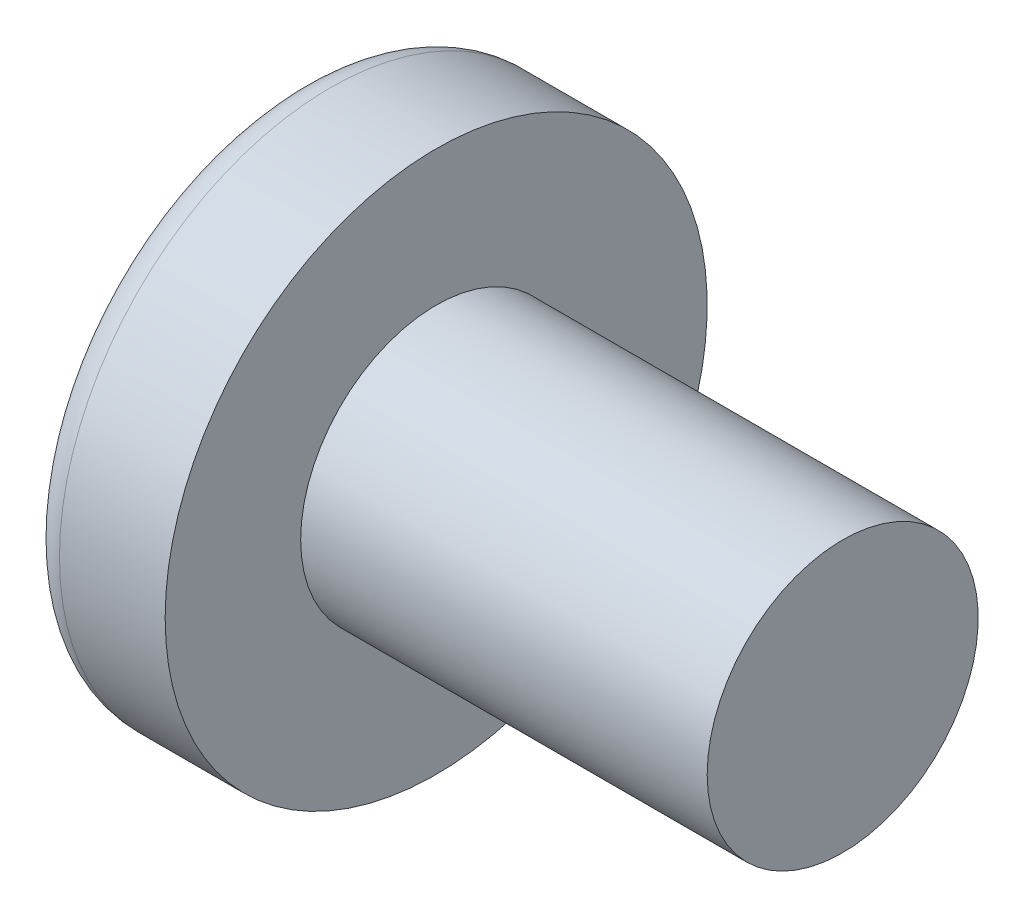
ISO-10303-21;
HEADER;
FILE_DESCRIPTION(('STEP AP214'),'2;1');
FILE_NAME('part.step','',(''),(''),'','','');
FILE_SCHEMA(('AUTOMOTIVE_DESIGN { 1 0 10303 214 1 1 1 1 }'));
ENDSEC;
DATA;
#1=APPLICATION_CONTEXT('core data for automotive mechanical design processes');
#2=APPLICATION_PROTOCOL_DEFINITION('international standard','automotive_design',2000,#1);
#3=PRODUCT_CONTEXT('',#1,'mechanical');
#4=PRODUCT('Part','Part','',(#3));
#5=PRODUCT_RELATED_PRODUCT_CATEGORY('part','',(#4));
#6=PRODUCT_DEFINITION_FORMATION('','',#4);
#7=PRODUCT_DEFINITION_CONTEXT('part definition',#1,'design');
#8=PRODUCT_DEFINITION('design','',#6,#7);
#9=PRODUCT_DEFINITION_SHAPE('','',#8);
#10=(LENGTH_UNIT() NAMED_UNIT(*) SI_UNIT(.MILLI.,.METRE.));
#11=(NAMED_UNIT(*) PLANE_ANGLE_UNIT() SI_UNIT($,.RADIAN.));
#12=(NAMED_UNIT(*) SI_UNIT($,.STERADIAN.) SOLID_ANGLE_UNIT());
#13=UNCERTAINTY_MEASURE_WITH_UNIT(LENGTH_MEASURE(1.E-05),#10,'distance_accuracy_value','');
#14=(GEOMETRIC_REPRESENTATION_CONTEXT(3) GLOBAL_UNCERTAINTY_ASSIGNED_CONTEXT((#13)) GLOBAL_UNIT_ASSIGNED_CONTEXT((#10,
#11,#12)) REPRESENTATION_CONTEXT('',''));
#15=CARTESIAN_POINT('',(0.,0.,0.));
#16=DIRECTION('',(0.,0.,1.));
#17=DIRECTION('',(1.,0.,0.));
#18=AXIS2_PLACEMENT_3D('',#15,#16,#17);
#19=CARTESIAN_POINT('',(3.2,0.,0.));
#20=DIRECTION('',(-1.,0.,0.));
#21=DIRECTION('',(0.,1.,0.));
#22=AXIS2_PLACEMENT_3D('',#19,#20,#21);
#23=SPHERICAL_SURFACE('',#22,3.2);
#24=CARTESIAN_POINT('',(0.627117875780583,0.,0.));
#25=DIRECTION('',(-1.,0.,0.));
#26=DIRECTION('',(0.,0.,1.));
#27=AXIS2_PLACEMENT_3D('',#24,#25,#26);
#28=CIRCLE('',#27,1.9027027027027);
#29=CARTESIAN_POINT('',(0.627117875780583,0.,1.9027027027027));
#30=VERTEX_POINT('',#29);
#31=EDGE_CURVE('E184',#30,#30,#28,.T.);
#32=ORIENTED_EDGE('',*,*,#31,.T.);
#33=EDGE_LOOP('',(#32));
#34=FACE_BOUND('',#33,.T.);
#35=CARTESIAN_POINT('',(3.19174554351625,-0.0818566934638238,0.));
#36=DIRECTION('',(-0.100331502261418,-0.994954064092392,0.));
#37=DIRECTION('',(0.994954064092392,-0.100331502261418,0.));
#38=AXIS2_PLACEMENT_3D('',#35,#36,#37);
#39=CIRCLE('',#38,3.1989422229361);
#40=CARTESIAN_POINT('',(0.118330716626357,0.228067490760365,0.83144431417242));
#41=VERTEX_POINT('',#40);
#42=CARTESIAN_POINT('',(0.0177814447975956,0.238206913129653,0.238206913129654));
#43=VERTEX_POINT('',#42);
#44=EDGE_CURVE('E235',#41,#43,#39,.T.);
#45=ORIENTED_EDGE('',*,*,#44,.F.);
#46=CARTESIAN_POINT('',(2.64043280070581,0.,-0.842892363493775));
#47=DIRECTION('',(0.553083521918191,0.,0.833125811497021));
#48=DIRECTION('',(0.833125811497021,0.,-0.553083521918191));
#49=AXIS2_PLACEMENT_3D('',#46,#47,#48);
#50=CIRCLE('',#49,3.03585523585001);
#51=CARTESIAN_POINT('',(0.118330716626356,-0.22806749076037,0.831444314172418));
#52=VERTEX_POINT('',#51);
#53=EDGE_CURVE('E183',#41,#52,#50,.T.);
#54=ORIENTED_EDGE('',*,*,#53,.T.);
#55=CARTESIAN_POINT('',(3.19174554351625,0.0818566934638236,0.));
#56=DIRECTION('',(-0.100331502261418,0.994954064092392,0.));
#57=DIRECTION('',(-0.994954064092392,-0.100331502261418,0.));
#58=AXIS2_PLACEMENT_3D('',#55,#56,#57);
#59=CIRCLE('',#58,3.1989422229361);
#60=CARTESIAN_POINT('',(0.0177814447975947,-0.238206913129655,0.238206913129654));
#61=VERTEX_POINT('',#60);
#62=EDGE_CURVE('E130',#61,#52,#59,.T.);
#63=ORIENTED_EDGE('',*,*,#62,.F.);
#64=CARTESIAN_POINT('',(3.19174554351625,0.,-0.0818566934638236));
#65=DIRECTION('',(-0.100331502261418,0.,-0.994954064092392));
#66=DIRECTION('',(-0.994954064092392,0.,0.100331502261418));
#67=AXIS2_PLACEMENT_3D('',#64,#65,#66);
#68=CIRCLE('',#67,3.1989422229361);
#69=CARTESIAN_POINT('',(0.118330716626357,-0.831444314172419,0.228067490760367));
#70=VERTEX_POINT('',#69);
#71=EDGE_CURVE('E157',#70,#61,#68,.T.);
#72=ORIENTED_EDGE('',*,*,#71,.F.);
#73=CARTESIAN_POINT('',(2.64043280070581,0.842892363493775,0.));
#74=DIRECTION('',(0.553083521918191,-0.833125811497021,0.));
#75=DIRECTION('',(0.833125811497021,0.553083521918191,0.));
#76=AXIS2_PLACEMENT_3D('',#73,#74,#75);
#77=CIRCLE('',#76,3.03585523585001);
#78=CARTESIAN_POINT('',(0.118330716626356,-0.831444314172419,-0.228067490760367));
#79=VERTEX_POINT('',#78);
#80=EDGE_CURVE('E166',#70,#79,#77,.T.);
#81=ORIENTED_EDGE('',*,*,#80,.T.);
#82=CARTESIAN_POINT('',(3.19174554351625,0.,0.0818566934638238));
#83=DIRECTION('',(-0.100331502261418,0.,0.994954064092392));
#84=DIRECTION('',(0.994954064092392,0.,0.100331502261418));
#85=AXIS2_PLACEMENT_3D('',#82,#83,#84);
#86=CIRCLE('',#85,3.1989422229361);
#87=CARTESIAN_POINT('',(0.0177814447975952,-0.238206913129653,-0.238206913129654));
#88=VERTEX_POINT('',#87);
#89=EDGE_CURVE('E73',#88,#79,#86,.T.);
#90=ORIENTED_EDGE('',*,*,#89,.F.);
#91=CARTESIAN_POINT('',(0.118330716626357,-0.228067490760364,-0.83144431417242));
#92=VERTEX_POINT('',#91);
#93=EDGE_CURVE('E236',#92,#88,#59,.T.);
#94=ORIENTED_EDGE('',*,*,#93,.F.);
#95=CARTESIAN_POINT('',(2.64043280070581,0.,0.842892363493775));
#96=DIRECTION('',(0.553083521918191,0.,-0.833125811497021));
#97=DIRECTION('',(-0.833125811497021,0.,-0.553083521918191));
#98=AXIS2_PLACEMENT_3D('',#95,#96,#97);
#99=CIRCLE('',#98,3.03585523585001);
#100=CARTESIAN_POINT('',(0.118330716626357,0.22806749076037,-0.831444314172418));
#101=VERTEX_POINT('',#100);
#102=EDGE_CURVE('E159',#92,#101,#99,.T.);
#103=ORIENTED_EDGE('',*,*,#102,.T.);
#104=CARTESIAN_POINT('',(0.0177814447975947,0.238206913129655,-0.238206913129654));
#105=VERTEX_POINT('',#104);
#106=EDGE_CURVE('E221',#105,#101,#39,.T.);
#107=ORIENTED_EDGE('',*,*,#106,.F.);
#108=CARTESIAN_POINT('',(0.118330716626357,0.831444314172419,-0.228067490760367));
#109=VERTEX_POINT('',#108);
#110=EDGE_CURVE('E66',#109,#105,#86,.T.);
#111=ORIENTED_EDGE('',*,*,#110,.F.);
#112=CARTESIAN_POINT('',(2.64043280070581,-0.842892363493775,0.));
#113=DIRECTION('',(0.553083521918191,0.833125811497021,0.));
#114=DIRECTION('',(-0.833125811497021,0.553083521918191,0.));
#115=AXIS2_PLACEMENT_3D('',#112,#113,#114);
#116=CIRCLE('',#115,3.03585523585001);
#117=CARTESIAN_POINT('',(0.118330716626357,0.831444314172419,0.228067490760367));
#118=VERTEX_POINT('',#117);
#119=EDGE_CURVE('E12',#109,#118,#116,.T.);
#120=ORIENTED_EDGE('',*,*,#119,.T.);
#121=EDGE_CURVE('E202',#43,#118,#68,.T.);
#122=ORIENTED_EDGE('',*,*,#121,.F.);
#123=EDGE_LOOP('',(#45,#54,#63,#72,#81,#90,#94,#103,#107,#111,#120,#122));
#124=FACE_BOUND('',#123,.T.);
#125=ADVANCED_FACE('F56',(#34,#124),#23,.T.);
#126=CARTESIAN_POINT('',(1.37075949367089,0.,-0.101772151898734));
#127=DIRECTION('',(-0.100331502261418,0.,0.994954064092392));
#128=DIRECTION('',(0.994954064092392,0.,0.100331502261418));
#129=AXIS2_PLACEMENT_3D('',#126,#127,#128);
#130=PLANE('',#129);
#131=ORIENTED_EDGE('',*,*,#110,.T.);
#132=DIRECTION('',(0.989983749746913,-0.0998302940921261,0.0998302940921257));
#133=VECTOR('',#132,1.);
#134=CARTESIAN_POINT('',(1.38081767298512,0.100757881715786,-0.100757881715786));
#135=LINE('',#134,#133);
#136=CARTESIAN_POINT('',(1.19,0.12,-0.12));
#137=VERTEX_POINT('',#136);
#138=EDGE_CURVE('E266',#105,#137,#135,.T.);
#139=ORIENTED_EDGE('',*,*,#138,.T.);
#140=DIRECTION('',(0.830201128729582,-0.551141925795269,0.083717760880294));
#141=VECTOR('',#140,1.);
#142=CARTESIAN_POINT('',(0.,0.91,-0.24));
#143=LINE('',#142,#141);
#144=EDGE_CURVE('E248',#109,#137,#143,.T.);
#145=ORIENTED_EDGE('',*,*,#144,.F.);
#146=EDGE_LOOP('',(#131,#139,#145));
#147=FACE_BOUND('',#146,.T.);
#148=ADVANCED_FACE('F312',(#147),#130,.T.);
#149=DIRECTION('',(0.830201128729582,0.551141925795269,0.083717760880294));
#150=VECTOR('',#149,1.);
#151=CARTESIAN_POINT('',(0.,-0.91,-0.24));
#152=LINE('',#151,#150);
#153=CARTESIAN_POINT('',(1.19,-0.12,-0.12));
#154=VERTEX_POINT('',#153);
#155=EDGE_CURVE('E168',#79,#154,#152,.T.);
#156=ORIENTED_EDGE('',*,*,#155,.T.);
#157=DIRECTION('',(-0.989983749746913,-0.0998302940921252,-0.0998302940921257));
#158=VECTOR('',#157,1.);
#159=CARTESIAN_POINT('',(1.38081767298512,-0.100757881715786,-0.100757881715786));
#160=LINE('',#159,#158);
#161=EDGE_CURVE('E271',#154,#88,#160,.T.);
#162=ORIENTED_EDGE('',*,*,#161,.T.);
#163=ORIENTED_EDGE('',*,*,#89,.T.);
#164=EDGE_LOOP('',(#156,#162,#163));
#165=FACE_BOUND('',#164,.T.);
#166=ADVANCED_FACE('F314',(#165),#130,.T.);
#167=CARTESIAN_POINT('',(1.37075949367089,0.,0.101772151898734));
#168=DIRECTION('',(-0.100331502261418,0.,-0.994954064092392));
#169=DIRECTION('',(-0.994954064092392,0.,0.100331502261418));
#170=AXIS2_PLACEMENT_3D('',#167,#168,#169);
#171=PLANE('',#170);
#172=DIRECTION('',(0.830201128729582,-0.551141925795269,-0.083717760880294));
#173=VECTOR('',#172,1.);
#174=CARTESIAN_POINT('',(0.,0.91,0.24));
#175=LINE('',#174,#173);
#176=CARTESIAN_POINT('',(1.19,0.12,0.12));
#177=VERTEX_POINT('',#176);
#178=EDGE_CURVE('E252',#118,#177,#175,.T.);
#179=ORIENTED_EDGE('',*,*,#178,.T.);
#180=DIRECTION('',(-0.989983749746913,0.0998302940921254,0.0998302940921256));
#181=VECTOR('',#180,1.);
#182=CARTESIAN_POINT('',(1.38081767298512,0.100757881715786,0.100757881715786));
#183=LINE('',#182,#181);
#184=EDGE_CURVE('E231',#177,#43,#183,.T.);
#185=ORIENTED_EDGE('',*,*,#184,.T.);
#186=ORIENTED_EDGE('',*,*,#121,.T.);
#187=EDGE_LOOP('',(#179,#185,#186));
#188=FACE_BOUND('',#187,.T.);
#189=ADVANCED_FACE('F299',(#188),#171,.T.);
#190=ORIENTED_EDGE('',*,*,#71,.T.);
#191=DIRECTION('',(0.989983749746913,0.099830294092126,-0.0998302940921256));
#192=VECTOR('',#191,1.);
#193=CARTESIAN_POINT('',(1.38081767298512,-0.100757881715786,0.100757881715786));
#194=LINE('',#193,#192);
#195=CARTESIAN_POINT('',(1.19,-0.12,0.12));
#196=VERTEX_POINT('',#195);
#197=EDGE_CURVE('E128',#61,#196,#194,.T.);
#198=ORIENTED_EDGE('',*,*,#197,.T.);
#199=DIRECTION('',(0.830201128729582,0.551141925795269,-0.0837177608802938));
#200=VECTOR('',#199,1.);
#201=CARTESIAN_POINT('',(0.,-0.91,0.24));
#202=LINE('',#201,#200);
#203=EDGE_CURVE('E155',#70,#196,#202,.T.);
#204=ORIENTED_EDGE('',*,*,#203,.F.);
#205=EDGE_LOOP('',(#190,#198,#204));
#206=FACE_BOUND('',#205,.T.);
#207=ADVANCED_FACE('F154',(#206),#171,.T.);
#208=CARTESIAN_POINT('',(-25.4,0.,0.));
#209=DIRECTION('',(-1.,0.,0.));
#210=DIRECTION('',(0.,0.,1.));
#211=AXIS2_PLACEMENT_3D('',#208,#209,#210);
#212=CYLINDRICAL_SURFACE('',#211,1.);
#213=CARTESIAN_POINT('',(4.6,0.,0.));
#214=DIRECTION('',(-1.,0.,0.));
#215=DIRECTION('',(0.,0.,1.));
#216=AXIS2_PLACEMENT_3D('',#213,#214,#215);
#217=CIRCLE('',#216,1.);
#218=CARTESIAN_POINT('',(4.6,0.,1.));
#219=VERTEX_POINT('',#218);
#220=EDGE_CURVE('E60',#219,#219,#217,.T.);
#221=ORIENTED_EDGE('',*,*,#220,.T.);
#222=EDGE_LOOP('',(#221));
#223=FACE_BOUND('',#222,.T.);
#224=CARTESIAN_POINT('',(1.6,0.,0.));
#225=DIRECTION('',(-1.,0.,0.));
#226=DIRECTION('',(0.,0.,1.));
#227=AXIS2_PLACEMENT_3D('',#224,#225,#226);
#228=CIRCLE('',#227,1.);
#229=CARTESIAN_POINT('',(1.6,0.,1.));
#230=VERTEX_POINT('',#229);
#231=EDGE_CURVE('E196',#230,#230,#228,.T.);
#232=ORIENTED_EDGE('',*,*,#231,.F.);
#233=EDGE_LOOP('',(#232));
#234=FACE_BOUND('',#233,.T.);
#235=ADVANCED_FACE('F341',(#223,#234),#212,.T.);
#236=CARTESIAN_POINT('',(1.6,1.,0.));
#237=DIRECTION('',(-1.,0.,0.));
#238=DIRECTION('',(0.,0.,1.));
#239=AXIS2_PLACEMENT_3D('',#236,#237,#238);
#240=PLANE('',#239);
#241=CARTESIAN_POINT('',(1.6,0.,0.));
#242=DIRECTION('',(-1.,0.,0.));
#243=DIRECTION('',(0.,0.,1.));
#244=AXIS2_PLACEMENT_3D('',#241,#242,#243);
#245=CIRCLE('',#244,2.);
#246=CARTESIAN_POINT('',(1.6,0.,2.));
#247=VERTEX_POINT('',#246);
#248=EDGE_CURVE('E192',#247,#247,#245,.T.);
#249=ORIENTED_EDGE('',*,*,#248,.F.);
#250=EDGE_LOOP('',(#249));
#251=FACE_BOUND('',#250,.T.);
#252=ORIENTED_EDGE('',*,*,#231,.T.);
#253=EDGE_LOOP('',(#252));
#254=FACE_BOUND('',#253,.T.);
#255=ADVANCED_FACE('F338',(#251,#254),#240,.F.);
#256=CARTESIAN_POINT('',(-25.4,0.,0.));
#257=DIRECTION('',(-1.,0.,0.));
#258=DIRECTION('',(0.,0.,1.));
#259=AXIS2_PLACEMENT_3D('',#256,#257,#258);
#260=CYLINDRICAL_SURFACE('',#259,2.);
#261=ORIENTED_EDGE('',*,*,#248,.T.);
#262=EDGE_LOOP('',(#261));
#263=FACE_BOUND('',#262,.T.);
#264=CARTESIAN_POINT('',(0.820084035097039,0.,0.));
#265=DIRECTION('',(-1.,0.,0.));
#266=DIRECTION('',(0.,0.,1.));
#267=AXIS2_PLACEMENT_3D('',#264,#265,#266);
#268=CIRCLE('',#267,2.);
#269=CARTESIAN_POINT('',(0.820084035097039,0.,2.));
#270=VERTEX_POINT('',#269);
#271=EDGE_CURVE('E188',#270,#270,#268,.T.);
#272=ORIENTED_EDGE('',*,*,#271,.F.);
#273=EDGE_LOOP('',(#272));
#274=FACE_BOUND('',#273,.T.);
#275=ADVANCED_FACE('F334',(#263,#274),#260,.T.);
#276=CARTESIAN_POINT('',(0.820084035097038,0.,0.));
#277=DIRECTION('',(-1.,0.,0.));
#278=DIRECTION('',(0.,0.,1.));
#279=AXIS2_PLACEMENT_3D('',#276,#277,#278);
#280=TOROIDAL_SURFACE('',#279,1.76,0.24);
#281=ORIENTED_EDGE('',*,*,#271,.T.);
#282=EDGE_LOOP('',(#281));
#283=FACE_BOUND('',#282,.T.);
#284=ORIENTED_EDGE('',*,*,#31,.F.);
#285=EDGE_LOOP('',(#284));
#286=FACE_BOUND('',#285,.T.);
#287=ADVANCED_FACE('F331',(#283,#286),#280,.T.);
#288=CARTESIAN_POINT('',(4.6,1.,0.));
#289=DIRECTION('',(1.,0.,0.));
#290=DIRECTION('',(0.,0.,-1.));
#291=AXIS2_PLACEMENT_3D('',#288,#289,#290);
#292=PLANE('',#291);
#293=ORIENTED_EDGE('',*,*,#220,.F.);
#294=EDGE_LOOP('',(#293));
#295=FACE_BOUND('',#294,.T.);
#296=ADVANCED_FACE('F58',(#295),#292,.T.);
#297=CARTESIAN_POINT('',(1.19,0.12,0.12));
#298=DIRECTION('',(0.553083521918191,0.833125811497021,0.));
#299=DIRECTION('',(-0.833125811497021,0.553083521918191,0.));
#300=AXIS2_PLACEMENT_3D('',#297,#298,#299);
#301=PLANE('',#300);
#302=ORIENTED_EDGE('',*,*,#144,.T.);
#303=DIRECTION('',(0.,0.,-1.));
#304=VECTOR('',#303,1.);
#305=CARTESIAN_POINT('',(1.19,0.12,0.12));
#306=LINE('',#305,#304);
#307=EDGE_CURVE('E148',#177,#137,#306,.T.);
#308=ORIENTED_EDGE('',*,*,#307,.F.);
#309=ORIENTED_EDGE('',*,*,#178,.F.);
#310=ORIENTED_EDGE('',*,*,#119,.F.);
#311=EDGE_LOOP('',(#302,#308,#309,#310));
#312=FACE_BOUND('',#311,.T.);
#313=ADVANCED_FACE('F302',(#312),#301,.F.);
#314=CARTESIAN_POINT('',(0.,-0.91,-0.24));
#315=DIRECTION('',(0.553083521918191,-0.833125811497021,0.));
#316=DIRECTION('',(0.833125811497021,0.553083521918191,0.));
#317=AXIS2_PLACEMENT_3D('',#314,#315,#316);
#318=PLANE('',#317);
#319=ORIENTED_EDGE('',*,*,#203,.T.);
#320=DIRECTION('',(0.,0.,1.));
#321=VECTOR('',#320,1.);
#322=CARTESIAN_POINT('',(1.19,-0.12,-0.12));
#323=LINE('',#322,#321);
#324=EDGE_CURVE('E147',#154,#196,#323,.T.);
#325=ORIENTED_EDGE('',*,*,#324,.F.);
#326=ORIENTED_EDGE('',*,*,#155,.F.);
#327=ORIENTED_EDGE('',*,*,#80,.F.);
#328=EDGE_LOOP('',(#319,#325,#326,#327));
#329=FACE_BOUND('',#328,.T.);
#330=ADVANCED_FACE('F163',(#329),#318,.F.);
#331=CARTESIAN_POINT('',(1.19,0.12,-0.12));
#332=DIRECTION('',(-1.,0.,0.));
#333=DIRECTION('',(0.,0.,1.));
#334=AXIS2_PLACEMENT_3D('',#331,#332,#333);
#335=PLANE('',#334);
#336=DIRECTION('',(0.,1.,0.));
#337=VECTOR('',#336,1.);
#338=CARTESIAN_POINT('',(1.19,-0.12,-0.12));
#339=LINE('',#338,#337);
#340=EDGE_CURVE('E172',#154,#137,#339,.T.);
#341=ORIENTED_EDGE('',*,*,#340,.F.);
#342=ORIENTED_EDGE('',*,*,#324,.T.);
#343=DIRECTION('',(0.,-1.,0.));
#344=VECTOR('',#343,1.);
#345=CARTESIAN_POINT('',(1.19,0.12,0.12));
#346=LINE('',#345,#344);
#347=EDGE_CURVE('E138',#177,#196,#346,.T.);
#348=ORIENTED_EDGE('',*,*,#347,.F.);
#349=ORIENTED_EDGE('',*,*,#307,.T.);
#350=EDGE_LOOP('',(#341,#342,#348,#349));
#351=FACE_BOUND('',#350,.T.);
#352=ADVANCED_FACE('F170',(#351),#335,.T.);
#353=CARTESIAN_POINT('',(0.,0.240000000000003,-0.909999999999999));
#354=DIRECTION('',(0.553083521918191,0.,-0.833125811497021));
#355=DIRECTION('',(0.833125811497021,0.,0.553083521918191));
#356=AXIS2_PLACEMENT_3D('',#353,#354,#355);
#357=PLANE('',#356);
#358=DIRECTION('',(0.830201128729582,0.0837177608802919,0.551141925795269));
#359=VECTOR('',#358,1.);
#360=CARTESIAN_POINT('',(0.,-0.239999999999997,-0.910000000000001));
#361=LINE('',#360,#359);
#362=EDGE_CURVE('E224',#92,#154,#361,.T.);
#363=ORIENTED_EDGE('',*,*,#362,.T.);
#364=ORIENTED_EDGE('',*,*,#340,.T.);
#365=DIRECTION('',(0.830201128729582,-0.0837177608802959,0.551141925795269));
#366=VECTOR('',#365,1.);
#367=CARTESIAN_POINT('',(0.,0.240000000000003,-0.909999999999999));
#368=LINE('',#367,#366);
#369=EDGE_CURVE('E135',#101,#137,#368,.T.);
#370=ORIENTED_EDGE('',*,*,#369,.F.);
#371=ORIENTED_EDGE('',*,*,#102,.F.);
#372=EDGE_LOOP('',(#363,#364,#370,#371));
#373=FACE_BOUND('',#372,.T.);
#374=ADVANCED_FACE('F309',(#373),#357,.F.);
#375=CARTESIAN_POINT('',(1.37075949367089,-0.101772151898734,0.));
#376=DIRECTION('',(-0.100331502261418,0.994954064092392,0.));
#377=DIRECTION('',(-0.994954064092392,-0.100331502261418,0.));
#378=AXIS2_PLACEMENT_3D('',#375,#376,#377);
#379=PLANE('',#378);
#380=ORIENTED_EDGE('',*,*,#93,.T.);
#381=ORIENTED_EDGE('',*,*,#161,.F.);
#382=ORIENTED_EDGE('',*,*,#362,.F.);
#383=EDGE_LOOP('',(#380,#381,#382));
#384=FACE_BOUND('',#383,.T.);
#385=ADVANCED_FACE('F393',(#384),#379,.T.);
#386=CARTESIAN_POINT('',(1.37075949367089,0.101772151898734,0.));
#387=DIRECTION('',(-0.100331502261418,-0.994954064092392,0.));
#388=DIRECTION('',(0.994954064092392,-0.100331502261418,0.));
#389=AXIS2_PLACEMENT_3D('',#386,#387,#388);
#390=PLANE('',#389);
#391=ORIENTED_EDGE('',*,*,#106,.T.);
#392=ORIENTED_EDGE('',*,*,#369,.T.);
#393=ORIENTED_EDGE('',*,*,#138,.F.);
#394=EDGE_LOOP('',(#391,#392,#393));
#395=FACE_BOUND('',#394,.T.);
#396=ADVANCED_FACE('F307',(#395),#390,.T.);
#397=CARTESIAN_POINT('',(1.19,-0.12,0.12));
#398=DIRECTION('',(0.553083521918191,0.,0.833125811497021));
#399=DIRECTION('',(-0.833125811497021,0.,0.553083521918191));
#400=AXIS2_PLACEMENT_3D('',#397,#398,#399);
#401=PLANE('',#400);
#402=DIRECTION('',(0.830201128729582,-0.0837177608802921,-0.551141925795269));
#403=VECTOR('',#402,1.);
#404=CARTESIAN_POINT('',(0.,0.239999999999997,0.910000000000001));
#405=LINE('',#404,#403);
#406=EDGE_CURVE('E134',#41,#177,#405,.T.);
#407=ORIENTED_EDGE('',*,*,#406,.T.);
#408=ORIENTED_EDGE('',*,*,#347,.T.);
#409=DIRECTION('',(0.830201128729582,0.0837177608802959,-0.551141925795269));
#410=VECTOR('',#409,1.);
#411=CARTESIAN_POINT('',(0.,-0.240000000000003,0.909999999999999));
#412=LINE('',#411,#410);
#413=EDGE_CURVE('E124',#52,#196,#412,.T.);
#414=ORIENTED_EDGE('',*,*,#413,.F.);
#415=ORIENTED_EDGE('',*,*,#53,.F.);
#416=EDGE_LOOP('',(#407,#408,#414,#415));
#417=FACE_BOUND('',#416,.T.);
#418=ADVANCED_FACE('F139',(#417),#401,.F.);
#419=ORIENTED_EDGE('',*,*,#44,.T.);
#420=ORIENTED_EDGE('',*,*,#184,.F.);
#421=ORIENTED_EDGE('',*,*,#406,.F.);
#422=EDGE_LOOP('',(#419,#420,#421));
#423=FACE_BOUND('',#422,.T.);
#424=ADVANCED_FACE('F407',(#423),#390,.T.);
#425=ORIENTED_EDGE('',*,*,#62,.T.);
#426=ORIENTED_EDGE('',*,*,#413,.T.);
#427=ORIENTED_EDGE('',*,*,#197,.F.);
#428=EDGE_LOOP('',(#425,#426,#427));
#429=FACE_BOUND('',#428,.T.);
#430=ADVANCED_FACE('F126',(#429),#379,.T.);
#431=CLOSED_SHELL('',(#125,#148,#166,#189,#207,#235,#255,#275,#287,#296,#313,#330,#352,#374,
#385,#396,#418,#424,#430));
#432=MANIFOLD_SOLID_BREP('B2',#431);
#433=ADVANCED_BREP_SHAPE_REPRESENTATION('',(#18,#432),#14);
#434=SHAPE_DEFINITION_REPRESENTATION(#9,#433);
ENDSEC;
END-ISO-10303-21;
